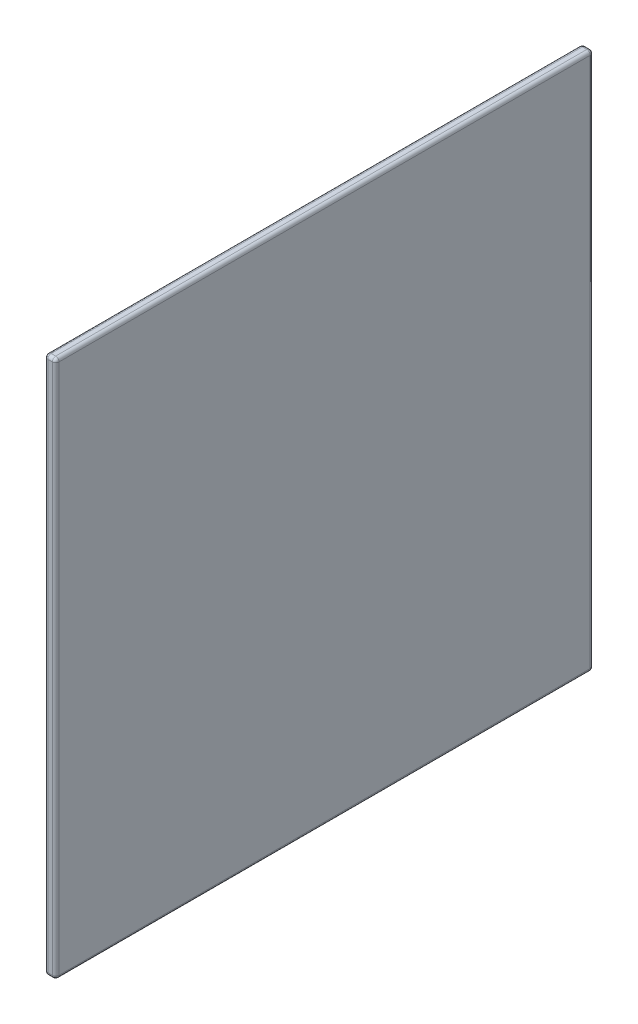
ISO-10303-21;
HEADER;
FILE_DESCRIPTION(('STEP AP214'),'2;1');
FILE_NAME('part.step','',(''),(''),'','','');
FILE_SCHEMA(('AUTOMOTIVE_DESIGN { 1 0 10303 214 1 1 1 1 }'));
ENDSEC;
DATA;
#1=APPLICATION_CONTEXT('core data for automotive mechanical design processes');
#2=APPLICATION_PROTOCOL_DEFINITION('international standard','automotive_design',2000,#1);
#3=PRODUCT_CONTEXT('',#1,'mechanical');
#4=PRODUCT('Part','Part','',(#3));
#5=PRODUCT_RELATED_PRODUCT_CATEGORY('part','',(#4));
#6=PRODUCT_DEFINITION_FORMATION('','',#4);
#7=PRODUCT_DEFINITION_CONTEXT('part definition',#1,'design');
#8=PRODUCT_DEFINITION('design','',#6,#7);
#9=PRODUCT_DEFINITION_SHAPE('','',#8);
#10=(LENGTH_UNIT() NAMED_UNIT(*) SI_UNIT(.MILLI.,.METRE.));
#11=(NAMED_UNIT(*) PLANE_ANGLE_UNIT() SI_UNIT($,.RADIAN.));
#12=(NAMED_UNIT(*) SI_UNIT($,.STERADIAN.) SOLID_ANGLE_UNIT());
#13=UNCERTAINTY_MEASURE_WITH_UNIT(LENGTH_MEASURE(1.E-05),#10,'distance_accuracy_value','');
#14=(GEOMETRIC_REPRESENTATION_CONTEXT(3) GLOBAL_UNCERTAINTY_ASSIGNED_CONTEXT((#13)) GLOBAL_UNIT_ASSIGNED_CONTEXT((#10,
#11,#12)) REPRESENTATION_CONTEXT('',''));
#15=CARTESIAN_POINT('',(0.,0.,0.));
#16=DIRECTION('',(0.,0.,1.));
#17=DIRECTION('',(1.,0.,0.));
#18=AXIS2_PLACEMENT_3D('',#15,#16,#17);
#19=CARTESIAN_POINT('',(8.45,23.7,23.7));
#20=DIRECTION('',(0.,-1.,0.));
#21=DIRECTION('',(1.,0.,0.));
#22=AXIS2_PLACEMENT_3D('',#19,#20,#21);
#23=SPHERICAL_SURFACE('',#22,0.3);
#24=CARTESIAN_POINT('',(8.45,23.7,23.7));
#25=DIRECTION('',(0.,0.,-1.));
#26=DIRECTION('',(1.,0.,0.));
#27=AXIS2_PLACEMENT_3D('',#24,#25,#26);
#28=CIRCLE('',#27,0.3);
#29=CARTESIAN_POINT('',(8.45,24.,23.7));
#30=VERTEX_POINT('',#29);
#31=CARTESIAN_POINT('',(8.75,23.7,23.7));
#32=VERTEX_POINT('',#31);
#33=EDGE_CURVE('E10',#30,#32,#28,.T.);
#34=ORIENTED_EDGE('',*,*,#33,.F.);
#35=CARTESIAN_POINT('',(8.45,23.7,23.7));
#36=DIRECTION('',(1.,0.,0.));
#37=DIRECTION('',(0.,0.,1.));
#38=AXIS2_PLACEMENT_3D('',#35,#36,#37);
#39=CIRCLE('',#38,0.3);
#40=CARTESIAN_POINT('',(8.45,23.7,24.));
#41=VERTEX_POINT('',#40);
#42=EDGE_CURVE('E297',#30,#41,#39,.T.);
#43=ORIENTED_EDGE('',*,*,#42,.T.);
#44=CARTESIAN_POINT('',(8.45,23.7,23.7));
#45=DIRECTION('',(0.,-1.,0.));
#46=DIRECTION('',(1.,0.,0.));
#47=AXIS2_PLACEMENT_3D('',#44,#45,#46);
#48=CIRCLE('',#47,0.3);
#49=EDGE_CURVE('E241',#32,#41,#48,.T.);
#50=ORIENTED_EDGE('',*,*,#49,.F.);
#51=EDGE_LOOP('',(#34,#43,#50));
#52=FACE_BOUND('',#51,.T.);
#53=ADVANCED_FACE('F16',(#52),#23,.T.);
#54=CARTESIAN_POINT('',(8.45,23.7,-23.7));
#55=DIRECTION('',(0.,0.,1.));
#56=DIRECTION('',(1.,0.,0.));
#57=AXIS2_PLACEMENT_3D('',#54,#55,#56);
#58=SPHERICAL_SURFACE('',#57,0.3);
#59=CARTESIAN_POINT('',(8.45,23.7,-23.7));
#60=DIRECTION('',(0.,-1.,0.));
#61=DIRECTION('',(1.,0.,0.));
#62=AXIS2_PLACEMENT_3D('',#59,#60,#61);
#63=CIRCLE('',#62,0.3);
#64=CARTESIAN_POINT('',(8.45,23.7,-24.));
#65=VERTEX_POINT('',#64);
#66=CARTESIAN_POINT('',(8.75,23.7,-23.7));
#67=VERTEX_POINT('',#66);
#68=EDGE_CURVE('E214',#65,#67,#63,.T.);
#69=ORIENTED_EDGE('',*,*,#68,.F.);
#70=CARTESIAN_POINT('',(8.45,23.7,-23.7));
#71=DIRECTION('',(1.,0.,0.));
#72=DIRECTION('',(0.,1.,0.));
#73=AXIS2_PLACEMENT_3D('',#70,#71,#72);
#74=CIRCLE('',#73,0.3);
#75=CARTESIAN_POINT('',(8.45,24.,-23.7));
#76=VERTEX_POINT('',#75);
#77=EDGE_CURVE('E230',#65,#76,#74,.T.);
#78=ORIENTED_EDGE('',*,*,#77,.T.);
#79=CARTESIAN_POINT('',(8.45,23.7,-23.7));
#80=DIRECTION('',(0.,0.,1.));
#81=DIRECTION('',(1.,0.,0.));
#82=AXIS2_PLACEMENT_3D('',#79,#80,#81);
#83=CIRCLE('',#82,0.3);
#84=EDGE_CURVE('E24',#67,#76,#83,.T.);
#85=ORIENTED_EDGE('',*,*,#84,.F.);
#86=EDGE_LOOP('',(#69,#78,#85));
#87=FACE_BOUND('',#86,.T.);
#88=ADVANCED_FACE('F310',(#87),#58,.T.);
#89=CARTESIAN_POINT('',(8.75,-24.,-24.));
#90=DIRECTION('',(1.,0.,0.));
#91=DIRECTION('',(0.,1.,0.));
#92=AXIS2_PLACEMENT_3D('',#89,#90,#91);
#93=PLANE('',#92);
#94=DIRECTION('',(0.,0.,1.));
#95=VECTOR('',#94,1.);
#96=CARTESIAN_POINT('',(8.75,-23.7,-24.));
#97=LINE('',#96,#95);
#98=CARTESIAN_POINT('',(8.75,-23.7,-23.7));
#99=VERTEX_POINT('',#98);
#100=CARTESIAN_POINT('',(8.75,-23.7,23.7));
#101=VERTEX_POINT('',#100);
#102=EDGE_CURVE('E227',#99,#101,#97,.T.);
#103=ORIENTED_EDGE('',*,*,#102,.F.);
#104=DIRECTION('',(0.,1.,0.));
#105=VECTOR('',#104,1.);
#106=CARTESIAN_POINT('',(8.75,-24.,-23.7));
#107=LINE('',#106,#105);
#108=EDGE_CURVE('E218',#99,#67,#107,.T.);
#109=ORIENTED_EDGE('',*,*,#108,.T.);
#110=DIRECTION('',(0.,0.,1.));
#111=VECTOR('',#110,1.);
#112=CARTESIAN_POINT('',(8.75,23.7,-24.));
#113=LINE('',#112,#111);
#114=EDGE_CURVE('E223',#67,#32,#113,.T.);
#115=ORIENTED_EDGE('',*,*,#114,.T.);
#116=DIRECTION('',(0.,1.,0.));
#117=VECTOR('',#116,1.);
#118=CARTESIAN_POINT('',(8.75,-24.,23.7));
#119=LINE('',#118,#117);
#120=EDGE_CURVE('E244',#101,#32,#119,.T.);
#121=ORIENTED_EDGE('',*,*,#120,.F.);
#122=EDGE_LOOP('',(#103,#109,#115,#121));
#123=FACE_BOUND('',#122,.T.);
#124=ADVANCED_FACE('F381',(#123),#93,.T.);
#125=CARTESIAN_POINT('',(8.45,-23.7,23.7));
#126=DIRECTION('',(0.,0.,-1.));
#127=DIRECTION('',(1.,0.,0.));
#128=AXIS2_PLACEMENT_3D('',#125,#126,#127);
#129=SPHERICAL_SURFACE('',#128,0.3);
#130=CARTESIAN_POINT('',(8.45,-23.7,23.7));
#131=DIRECTION('',(0.,1.,0.));
#132=DIRECTION('',(1.,0.,0.));
#133=AXIS2_PLACEMENT_3D('',#130,#131,#132);
#134=CIRCLE('',#133,0.3);
#135=CARTESIAN_POINT('',(8.45,-23.7,24.));
#136=VERTEX_POINT('',#135);
#137=EDGE_CURVE('E226',#136,#101,#134,.T.);
#138=ORIENTED_EDGE('',*,*,#137,.F.);
#139=CARTESIAN_POINT('',(8.45,-23.7,23.7));
#140=DIRECTION('',(1.,0.,0.));
#141=DIRECTION('',(0.,-1.,0.));
#142=AXIS2_PLACEMENT_3D('',#139,#140,#141);
#143=CIRCLE('',#142,0.3);
#144=CARTESIAN_POINT('',(8.45,-24.,23.7));
#145=VERTEX_POINT('',#144);
#146=EDGE_CURVE('E140',#136,#145,#143,.T.);
#147=ORIENTED_EDGE('',*,*,#146,.T.);
#148=CARTESIAN_POINT('',(8.45,-23.7,23.7));
#149=DIRECTION('',(0.,0.,-1.));
#150=DIRECTION('',(1.,0.,0.));
#151=AXIS2_PLACEMENT_3D('',#148,#149,#150);
#152=CIRCLE('',#151,0.3);
#153=EDGE_CURVE('E284',#101,#145,#152,.T.);
#154=ORIENTED_EDGE('',*,*,#153,.F.);
#155=EDGE_LOOP('',(#138,#147,#154));
#156=FACE_BOUND('',#155,.T.);
#157=ADVANCED_FACE('F376',(#156),#129,.T.);
#158=CARTESIAN_POINT('',(8.45,-23.7,-23.7));
#159=DIRECTION('',(0.,0.,1.));
#160=DIRECTION('',(1.,0.,0.));
#161=AXIS2_PLACEMENT_3D('',#158,#159,#160);
#162=SPHERICAL_SURFACE('',#161,0.3);
#163=CARTESIAN_POINT('',(8.45,-23.7,-23.7));
#164=DIRECTION('',(0.,0.,-1.));
#165=DIRECTION('',(1.,0.,0.));
#166=AXIS2_PLACEMENT_3D('',#163,#164,#165);
#167=CIRCLE('',#166,0.3);
#168=CARTESIAN_POINT('',(8.45,-24.,-23.7));
#169=VERTEX_POINT('',#168);
#170=EDGE_CURVE('E231',#99,#169,#167,.T.);
#171=ORIENTED_EDGE('',*,*,#170,.T.);
#172=CARTESIAN_POINT('',(8.45,-23.7,-23.7));
#173=DIRECTION('',(-1.,0.,0.));
#174=DIRECTION('',(0.,-1.,0.));
#175=AXIS2_PLACEMENT_3D('',#172,#173,#174);
#176=CIRCLE('',#175,0.3);
#177=CARTESIAN_POINT('',(8.45,-23.7,-24.));
#178=VERTEX_POINT('',#177);
#179=EDGE_CURVE('E275',#178,#169,#176,.T.);
#180=ORIENTED_EDGE('',*,*,#179,.F.);
#181=CARTESIAN_POINT('',(8.45,-23.7,-23.7));
#182=DIRECTION('',(0.,-1.,0.));
#183=DIRECTION('',(1.,0.,0.));
#184=AXIS2_PLACEMENT_3D('',#181,#182,#183);
#185=CIRCLE('',#184,0.3);
#186=EDGE_CURVE('E219',#178,#99,#185,.T.);
#187=ORIENTED_EDGE('',*,*,#186,.T.);
#188=EDGE_LOOP('',(#171,#180,#187));
#189=FACE_BOUND('',#188,.T.);
#190=ADVANCED_FACE('F396',(#189),#162,.T.);
#191=CARTESIAN_POINT('',(8.45,23.7,-24.));
#192=DIRECTION('',(0.,0.,1.));
#193=DIRECTION('',(1.,0.,0.));
#194=AXIS2_PLACEMENT_3D('',#191,#192,#193);
#195=CYLINDRICAL_SURFACE('',#194,0.3);
#196=ORIENTED_EDGE('',*,*,#114,.F.);
#197=ORIENTED_EDGE('',*,*,#84,.T.);
#198=DIRECTION('',(0.,0.,1.));
#199=VECTOR('',#198,1.);
#200=CARTESIAN_POINT('',(8.45,24.,-24.));
#201=LINE('',#200,#199);
#202=EDGE_CURVE('E271',#76,#30,#201,.T.);
#203=ORIENTED_EDGE('',*,*,#202,.T.);
#204=ORIENTED_EDGE('',*,*,#33,.T.);
#205=EDGE_LOOP('',(#196,#197,#203,#204));
#206=FACE_BOUND('',#205,.T.);
#207=ADVANCED_FACE('F307',(#206),#195,.T.);
#208=CARTESIAN_POINT('',(8.45,-24.,23.7));
#209=DIRECTION('',(0.,1.,0.));
#210=DIRECTION('',(1.,0.,0.));
#211=AXIS2_PLACEMENT_3D('',#208,#209,#210);
#212=CYLINDRICAL_SURFACE('',#211,0.3);
#213=ORIENTED_EDGE('',*,*,#120,.T.);
#214=ORIENTED_EDGE('',*,*,#49,.T.);
#215=DIRECTION('',(0.,1.,0.));
#216=VECTOR('',#215,1.);
#217=CARTESIAN_POINT('',(8.45,-24.,24.));
#218=LINE('',#217,#216);
#219=EDGE_CURVE('E146',#136,#41,#218,.T.);
#220=ORIENTED_EDGE('',*,*,#219,.F.);
#221=ORIENTED_EDGE('',*,*,#137,.T.);
#222=EDGE_LOOP('',(#213,#214,#220,#221));
#223=FACE_BOUND('',#222,.T.);
#224=ADVANCED_FACE('F379',(#223),#212,.T.);
#225=CARTESIAN_POINT('',(7.75,23.7,23.7));
#226=DIRECTION('',(1.,0.,0.));
#227=DIRECTION('',(0.,1.,0.));
#228=AXIS2_PLACEMENT_3D('',#225,#226,#227);
#229=CYLINDRICAL_SURFACE('',#228,0.3);
#230=CARTESIAN_POINT('',(8.05,23.7,23.7));
#231=DIRECTION('',(1.,0.,0.));
#232=DIRECTION('',(0.,0.,1.));
#233=AXIS2_PLACEMENT_3D('',#230,#231,#232);
#234=CIRCLE('',#233,0.3);
#235=CARTESIAN_POINT('',(8.05,24.,23.7));
#236=VERTEX_POINT('',#235);
#237=CARTESIAN_POINT('',(8.05,23.7,24.));
#238=VERTEX_POINT('',#237);
#239=EDGE_CURVE('E266',#236,#238,#234,.T.);
#240=ORIENTED_EDGE('',*,*,#239,.T.);
#241=DIRECTION('',(1.,0.,0.));
#242=VECTOR('',#241,1.);
#243=CARTESIAN_POINT('',(7.75,23.7,24.));
#244=LINE('',#243,#242);
#245=EDGE_CURVE('E165',#238,#41,#244,.T.);
#246=ORIENTED_EDGE('',*,*,#245,.T.);
#247=ORIENTED_EDGE('',*,*,#42,.F.);
#248=DIRECTION('',(1.,0.,0.));
#249=VECTOR('',#248,1.);
#250=CARTESIAN_POINT('',(7.75,24.,23.7));
#251=LINE('',#250,#249);
#252=EDGE_CURVE('E267',#236,#30,#251,.T.);
#253=ORIENTED_EDGE('',*,*,#252,.F.);
#254=EDGE_LOOP('',(#240,#246,#247,#253));
#255=FACE_BOUND('',#254,.T.);
#256=ADVANCED_FACE('F322',(#255),#229,.T.);
#257=CARTESIAN_POINT('',(8.45,-24.,-23.7));
#258=DIRECTION('',(0.,1.,0.));
#259=DIRECTION('',(1.,0.,0.));
#260=AXIS2_PLACEMENT_3D('',#257,#258,#259);
#261=CYLINDRICAL_SURFACE('',#260,0.3);
#262=ORIENTED_EDGE('',*,*,#186,.F.);
#263=DIRECTION('',(0.,1.,0.));
#264=VECTOR('',#263,1.);
#265=CARTESIAN_POINT('',(8.45,-24.,-24.));
#266=LINE('',#265,#264);
#267=EDGE_CURVE('E251',#178,#65,#266,.T.);
#268=ORIENTED_EDGE('',*,*,#267,.T.);
#269=ORIENTED_EDGE('',*,*,#68,.T.);
#270=ORIENTED_EDGE('',*,*,#108,.F.);
#271=EDGE_LOOP('',(#262,#268,#269,#270));
#272=FACE_BOUND('',#271,.T.);
#273=ADVANCED_FACE('F406',(#272),#261,.T.);
#274=CARTESIAN_POINT('',(7.75,23.7,-23.7));
#275=DIRECTION('',(1.,0.,0.));
#276=DIRECTION('',(0.,1.,0.));
#277=AXIS2_PLACEMENT_3D('',#274,#275,#276);
#278=CYLINDRICAL_SURFACE('',#277,0.3);
#279=DIRECTION('',(1.,0.,0.));
#280=VECTOR('',#279,1.);
#281=CARTESIAN_POINT('',(7.75,24.,-23.7));
#282=LINE('',#281,#280);
#283=CARTESIAN_POINT('',(8.05,24.,-23.7));
#284=VERTEX_POINT('',#283);
#285=EDGE_CURVE('E274',#284,#76,#282,.T.);
#286=ORIENTED_EDGE('',*,*,#285,.T.);
#287=ORIENTED_EDGE('',*,*,#77,.F.);
#288=DIRECTION('',(1.,0.,0.));
#289=VECTOR('',#288,1.);
#290=CARTESIAN_POINT('',(7.75,23.7,-24.));
#291=LINE('',#290,#289);
#292=CARTESIAN_POINT('',(8.05,23.7,-24.));
#293=VERTEX_POINT('',#292);
#294=EDGE_CURVE('E247',#293,#65,#291,.T.);
#295=ORIENTED_EDGE('',*,*,#294,.F.);
#296=CARTESIAN_POINT('',(8.05,23.7,-23.7));
#297=DIRECTION('',(1.,0.,0.));
#298=DIRECTION('',(0.,1.,0.));
#299=AXIS2_PLACEMENT_3D('',#296,#297,#298);
#300=CIRCLE('',#299,0.3);
#301=EDGE_CURVE('E147',#293,#284,#300,.T.);
#302=ORIENTED_EDGE('',*,*,#301,.T.);
#303=EDGE_LOOP('',(#286,#287,#295,#302));
#304=FACE_BOUND('',#303,.T.);
#305=ADVANCED_FACE('F313',(#304),#278,.T.);
#306=CARTESIAN_POINT('',(8.45,-23.7,-24.));
#307=DIRECTION('',(0.,0.,1.));
#308=DIRECTION('',(1.,0.,0.));
#309=AXIS2_PLACEMENT_3D('',#306,#307,#308);
#310=CYLINDRICAL_SURFACE('',#309,0.3);
#311=ORIENTED_EDGE('',*,*,#153,.T.);
#312=DIRECTION('',(0.,0.,1.));
#313=VECTOR('',#312,1.);
#314=CARTESIAN_POINT('',(8.45,-24.,-24.));
#315=LINE('',#314,#313);
#316=EDGE_CURVE('E236',#169,#145,#315,.T.);
#317=ORIENTED_EDGE('',*,*,#316,.F.);
#318=ORIENTED_EDGE('',*,*,#170,.F.);
#319=ORIENTED_EDGE('',*,*,#102,.T.);
#320=EDGE_LOOP('',(#311,#317,#318,#319));
#321=FACE_BOUND('',#320,.T.);
#322=ADVANCED_FACE('F372',(#321),#310,.T.);
#323=CARTESIAN_POINT('',(7.75,-23.7,23.7));
#324=DIRECTION('',(1.,0.,0.));
#325=DIRECTION('',(0.,-1.,0.));
#326=AXIS2_PLACEMENT_3D('',#323,#324,#325);
#327=CYLINDRICAL_SURFACE('',#326,0.3);
#328=DIRECTION('',(1.,0.,0.));
#329=VECTOR('',#328,1.);
#330=CARTESIAN_POINT('',(7.75,-24.,23.7));
#331=LINE('',#330,#329);
#332=CARTESIAN_POINT('',(8.05,-24.,23.7));
#333=VERTEX_POINT('',#332);
#334=EDGE_CURVE('E240',#333,#145,#331,.T.);
#335=ORIENTED_EDGE('',*,*,#334,.T.);
#336=ORIENTED_EDGE('',*,*,#146,.F.);
#337=DIRECTION('',(1.,0.,0.));
#338=VECTOR('',#337,1.);
#339=CARTESIAN_POINT('',(7.75,-23.7,24.));
#340=LINE('',#339,#338);
#341=CARTESIAN_POINT('',(8.05,-23.7,24.));
#342=VERTEX_POINT('',#341);
#343=EDGE_CURVE('E133',#342,#136,#340,.T.);
#344=ORIENTED_EDGE('',*,*,#343,.F.);
#345=CARTESIAN_POINT('',(8.05,-23.7,23.7));
#346=DIRECTION('',(1.,0.,0.));
#347=DIRECTION('',(0.,-1.,0.));
#348=AXIS2_PLACEMENT_3D('',#345,#346,#347);
#349=CIRCLE('',#348,0.3);
#350=EDGE_CURVE('E137',#342,#333,#349,.T.);
#351=ORIENTED_EDGE('',*,*,#350,.T.);
#352=EDGE_LOOP('',(#335,#336,#344,#351));
#353=FACE_BOUND('',#352,.T.);
#354=ADVANCED_FACE('F136',(#353),#327,.T.);
#355=CARTESIAN_POINT('',(7.75,-23.7,-23.7));
#356=DIRECTION('',(1.,0.,0.));
#357=DIRECTION('',(0.,-1.,0.));
#358=AXIS2_PLACEMENT_3D('',#355,#356,#357);
#359=CYLINDRICAL_SURFACE('',#358,0.3);
#360=CARTESIAN_POINT('',(8.05,-23.7,-23.7));
#361=DIRECTION('',(-1.,0.,0.));
#362=DIRECTION('',(0.,-1.,0.));
#363=AXIS2_PLACEMENT_3D('',#360,#361,#362);
#364=CIRCLE('',#363,0.3);
#365=CARTESIAN_POINT('',(8.05,-23.7,-24.));
#366=VERTEX_POINT('',#365);
#367=CARTESIAN_POINT('',(8.05,-24.,-23.7));
#368=VERTEX_POINT('',#367);
#369=EDGE_CURVE('E158',#366,#368,#364,.T.);
#370=ORIENTED_EDGE('',*,*,#369,.F.);
#371=DIRECTION('',(1.,0.,0.));
#372=VECTOR('',#371,1.);
#373=CARTESIAN_POINT('',(7.75,-23.7,-24.));
#374=LINE('',#373,#372);
#375=EDGE_CURVE('E255',#366,#178,#374,.T.);
#376=ORIENTED_EDGE('',*,*,#375,.T.);
#377=ORIENTED_EDGE('',*,*,#179,.T.);
#378=DIRECTION('',(1.,0.,0.));
#379=VECTOR('',#378,1.);
#380=CARTESIAN_POINT('',(7.75,-24.,-23.7));
#381=LINE('',#380,#379);
#382=EDGE_CURVE('E157',#368,#169,#381,.T.);
#383=ORIENTED_EDGE('',*,*,#382,.F.);
#384=EDGE_LOOP('',(#370,#376,#377,#383));
#385=FACE_BOUND('',#384,.T.);
#386=ADVANCED_FACE('F360',(#385),#359,.T.);
#387=CARTESIAN_POINT('',(7.75,24.,-24.));
#388=DIRECTION('',(0.,1.,0.));
#389=DIRECTION('',(1.,0.,0.));
#390=AXIS2_PLACEMENT_3D('',#387,#388,#389);
#391=PLANE('',#390);
#392=DIRECTION('',(0.,0.,1.));
#393=VECTOR('',#392,1.);
#394=CARTESIAN_POINT('',(8.05,24.,-24.));
#395=LINE('',#394,#393);
#396=EDGE_CURVE('E210',#284,#236,#395,.T.);
#397=ORIENTED_EDGE('',*,*,#396,.T.);
#398=ORIENTED_EDGE('',*,*,#252,.T.);
#399=ORIENTED_EDGE('',*,*,#202,.F.);
#400=ORIENTED_EDGE('',*,*,#285,.F.);
#401=EDGE_LOOP('',(#397,#398,#399,#400));
#402=FACE_BOUND('',#401,.T.);
#403=ADVANCED_FACE('F316',(#402),#391,.T.);
#404=CARTESIAN_POINT('',(8.05,23.7,23.7));
#405=DIRECTION('',(0.,-1.,0.));
#406=DIRECTION('',(-1.,0.,0.));
#407=AXIS2_PLACEMENT_3D('',#404,#405,#406);
#408=SPHERICAL_SURFACE('',#407,0.3);
#409=CARTESIAN_POINT('',(8.05,23.7,23.7));
#410=DIRECTION('',(0.,1.,0.));
#411=DIRECTION('',(-1.,0.,0.));
#412=AXIS2_PLACEMENT_3D('',#409,#410,#411);
#413=CIRCLE('',#412,0.3);
#414=CARTESIAN_POINT('',(7.75,23.7,23.7));
#415=VERTEX_POINT('',#414);
#416=EDGE_CURVE('E170',#415,#238,#413,.T.);
#417=ORIENTED_EDGE('',*,*,#416,.T.);
#418=ORIENTED_EDGE('',*,*,#239,.F.);
#419=CARTESIAN_POINT('',(8.05,23.7,23.7));
#420=DIRECTION('',(0.,0.,1.));
#421=DIRECTION('',(-1.,0.,0.));
#422=AXIS2_PLACEMENT_3D('',#419,#420,#421);
#423=CIRCLE('',#422,0.3);
#424=EDGE_CURVE('E198',#236,#415,#423,.T.);
#425=ORIENTED_EDGE('',*,*,#424,.T.);
#426=EDGE_LOOP('',(#417,#418,#425));
#427=FACE_BOUND('',#426,.T.);
#428=ADVANCED_FACE('F324',(#427),#408,.T.);
#429=CARTESIAN_POINT('',(7.75,-24.,24.));
#430=DIRECTION('',(0.,0.,1.));
#431=DIRECTION('',(1.,0.,0.));
#432=AXIS2_PLACEMENT_3D('',#429,#430,#431);
#433=PLANE('',#432);
#434=DIRECTION('',(0.,1.,0.));
#435=VECTOR('',#434,1.);
#436=CARTESIAN_POINT('',(8.05,-24.,24.));
#437=LINE('',#436,#435);
#438=EDGE_CURVE('E162',#342,#238,#437,.T.);
#439=ORIENTED_EDGE('',*,*,#438,.F.);
#440=ORIENTED_EDGE('',*,*,#343,.T.);
#441=ORIENTED_EDGE('',*,*,#219,.T.);
#442=ORIENTED_EDGE('',*,*,#245,.F.);
#443=EDGE_LOOP('',(#439,#440,#441,#442));
#444=FACE_BOUND('',#443,.T.);
#445=ADVANCED_FACE('F163',(#444),#433,.T.);
#446=CARTESIAN_POINT('',(8.05,23.7,-23.7));
#447=DIRECTION('',(0.,0.,1.));
#448=DIRECTION('',(-1.,0.,0.));
#449=AXIS2_PLACEMENT_3D('',#446,#447,#448);
#450=SPHERICAL_SURFACE('',#449,0.3);
#451=CARTESIAN_POINT('',(8.05,23.7,-23.7));
#452=DIRECTION('',(0.,0.,-1.));
#453=DIRECTION('',(-1.,0.,0.));
#454=AXIS2_PLACEMENT_3D('',#451,#452,#453);
#455=CIRCLE('',#454,0.3);
#456=CARTESIAN_POINT('',(7.75,23.7,-23.7));
#457=VERTEX_POINT('',#456);
#458=EDGE_CURVE('E187',#457,#284,#455,.T.);
#459=ORIENTED_EDGE('',*,*,#458,.T.);
#460=ORIENTED_EDGE('',*,*,#301,.F.);
#461=CARTESIAN_POINT('',(8.05,23.7,-23.7));
#462=DIRECTION('',(0.,1.,0.));
#463=DIRECTION('',(-1.,0.,0.));
#464=AXIS2_PLACEMENT_3D('',#461,#462,#463);
#465=CIRCLE('',#464,0.3);
#466=EDGE_CURVE('E202',#293,#457,#465,.T.);
#467=ORIENTED_EDGE('',*,*,#466,.T.);
#468=EDGE_LOOP('',(#459,#460,#467));
#469=FACE_BOUND('',#468,.T.);
#470=ADVANCED_FACE('F354',(#469),#450,.T.);
#471=CARTESIAN_POINT('',(7.75,-24.,-24.));
#472=DIRECTION('',(0.,0.,1.));
#473=DIRECTION('',(1.,0.,0.));
#474=AXIS2_PLACEMENT_3D('',#471,#472,#473);
#475=PLANE('',#474);
#476=ORIENTED_EDGE('',*,*,#294,.T.);
#477=ORIENTED_EDGE('',*,*,#267,.F.);
#478=ORIENTED_EDGE('',*,*,#375,.F.);
#479=DIRECTION('',(0.,1.,0.));
#480=VECTOR('',#479,1.);
#481=CARTESIAN_POINT('',(8.05,-24.,-24.));
#482=LINE('',#481,#480);
#483=EDGE_CURVE('E183',#366,#293,#482,.T.);
#484=ORIENTED_EDGE('',*,*,#483,.T.);
#485=EDGE_LOOP('',(#476,#477,#478,#484));
#486=FACE_BOUND('',#485,.T.);
#487=ADVANCED_FACE('F357',(#486),#475,.F.);
#488=CARTESIAN_POINT('',(7.75,-24.,-24.));
#489=DIRECTION('',(0.,1.,0.));
#490=DIRECTION('',(1.,0.,0.));
#491=AXIS2_PLACEMENT_3D('',#488,#489,#490);
#492=PLANE('',#491);
#493=ORIENTED_EDGE('',*,*,#382,.T.);
#494=ORIENTED_EDGE('',*,*,#316,.T.);
#495=ORIENTED_EDGE('',*,*,#334,.F.);
#496=DIRECTION('',(0.,0.,1.));
#497=VECTOR('',#496,1.);
#498=CARTESIAN_POINT('',(8.05,-24.,-24.));
#499=LINE('',#498,#497);
#500=EDGE_CURVE('E192',#368,#333,#499,.T.);
#501=ORIENTED_EDGE('',*,*,#500,.F.);
#502=EDGE_LOOP('',(#493,#494,#495,#501));
#503=FACE_BOUND('',#502,.T.);
#504=ADVANCED_FACE('F368',(#503),#492,.F.);
#505=CARTESIAN_POINT('',(8.05,-23.7,23.7));
#506=DIRECTION('',(0.,0.,-1.));
#507=DIRECTION('',(-1.,0.,0.));
#508=AXIS2_PLACEMENT_3D('',#505,#506,#507);
#509=SPHERICAL_SURFACE('',#508,0.3);
#510=CARTESIAN_POINT('',(8.05,-23.7,23.7));
#511=DIRECTION('',(0.,0.,1.));
#512=DIRECTION('',(-1.,0.,0.));
#513=AXIS2_PLACEMENT_3D('',#510,#511,#512);
#514=CIRCLE('',#513,0.3);
#515=CARTESIAN_POINT('',(7.75,-23.7,23.7));
#516=VERTEX_POINT('',#515);
#517=EDGE_CURVE('E154',#516,#333,#514,.T.);
#518=ORIENTED_EDGE('',*,*,#517,.T.);
#519=ORIENTED_EDGE('',*,*,#350,.F.);
#520=CARTESIAN_POINT('',(8.05,-23.7,23.7));
#521=DIRECTION('',(0.,-1.,0.));
#522=DIRECTION('',(-1.,0.,0.));
#523=AXIS2_PLACEMENT_3D('',#520,#521,#522);
#524=CIRCLE('',#523,0.3);
#525=EDGE_CURVE('E152',#342,#516,#524,.T.);
#526=ORIENTED_EDGE('',*,*,#525,.T.);
#527=EDGE_LOOP('',(#518,#519,#526));
#528=FACE_BOUND('',#527,.T.);
#529=ADVANCED_FACE('F150',(#528),#509,.T.);
#530=CARTESIAN_POINT('',(8.05,-23.7,-23.7));
#531=DIRECTION('',(0.,0.,1.));
#532=DIRECTION('',(-1.,0.,0.));
#533=AXIS2_PLACEMENT_3D('',#530,#531,#532);
#534=SPHERICAL_SURFACE('',#533,0.3);
#535=CARTESIAN_POINT('',(8.05,-23.7,-23.7));
#536=DIRECTION('',(0.,1.,0.));
#537=DIRECTION('',(-1.,0.,0.));
#538=AXIS2_PLACEMENT_3D('',#535,#536,#537);
#539=CIRCLE('',#538,0.3);
#540=CARTESIAN_POINT('',(7.75,-23.7,-23.7));
#541=VERTEX_POINT('',#540);
#542=EDGE_CURVE('E177',#366,#541,#539,.T.);
#543=ORIENTED_EDGE('',*,*,#542,.F.);
#544=ORIENTED_EDGE('',*,*,#369,.T.);
#545=CARTESIAN_POINT('',(8.05,-23.7,-23.7));
#546=DIRECTION('',(0.,0.,1.));
#547=DIRECTION('',(-1.,0.,0.));
#548=AXIS2_PLACEMENT_3D('',#545,#546,#547);
#549=CIRCLE('',#548,0.3);
#550=EDGE_CURVE('E189',#541,#368,#549,.T.);
#551=ORIENTED_EDGE('',*,*,#550,.F.);
#552=EDGE_LOOP('',(#543,#544,#551));
#553=FACE_BOUND('',#552,.T.);
#554=ADVANCED_FACE('F363',(#553),#534,.T.);
#555=CARTESIAN_POINT('',(8.05,23.7,-24.));
#556=DIRECTION('',(0.,0.,1.));
#557=DIRECTION('',(-1.,0.,0.));
#558=AXIS2_PLACEMENT_3D('',#555,#556,#557);
#559=CYLINDRICAL_SURFACE('',#558,0.3);
#560=ORIENTED_EDGE('',*,*,#424,.F.);
#561=ORIENTED_EDGE('',*,*,#396,.F.);
#562=ORIENTED_EDGE('',*,*,#458,.F.);
#563=DIRECTION('',(0.,0.,1.));
#564=VECTOR('',#563,1.);
#565=CARTESIAN_POINT('',(7.75,23.7,-24.));
#566=LINE('',#565,#564);
#567=EDGE_CURVE('E335',#457,#415,#566,.T.);
#568=ORIENTED_EDGE('',*,*,#567,.T.);
#569=EDGE_LOOP('',(#560,#561,#562,#568));
#570=FACE_BOUND('',#569,.T.);
#571=ADVANCED_FACE('F352',(#570),#559,.T.);
#572=CARTESIAN_POINT('',(8.05,-24.,23.7));
#573=DIRECTION('',(0.,1.,0.));
#574=DIRECTION('',(-1.,0.,0.));
#575=AXIS2_PLACEMENT_3D('',#572,#573,#574);
#576=CYLINDRICAL_SURFACE('',#575,0.3);
#577=ORIENTED_EDGE('',*,*,#525,.F.);
#578=ORIENTED_EDGE('',*,*,#438,.T.);
#579=ORIENTED_EDGE('',*,*,#416,.F.);
#580=DIRECTION('',(0.,1.,0.));
#581=VECTOR('',#580,1.);
#582=CARTESIAN_POINT('',(7.75,-24.,23.7));
#583=LINE('',#582,#581);
#584=EDGE_CURVE('E175',#516,#415,#583,.T.);
#585=ORIENTED_EDGE('',*,*,#584,.F.);
#586=EDGE_LOOP('',(#577,#578,#579,#585));
#587=FACE_BOUND('',#586,.T.);
#588=ADVANCED_FACE('F173',(#587),#576,.T.);
#589=CARTESIAN_POINT('',(8.05,-24.,-23.7));
#590=DIRECTION('',(0.,1.,0.));
#591=DIRECTION('',(-1.,0.,0.));
#592=AXIS2_PLACEMENT_3D('',#589,#590,#591);
#593=CYLINDRICAL_SURFACE('',#592,0.3);
#594=DIRECTION('',(0.,1.,0.));
#595=VECTOR('',#594,1.);
#596=CARTESIAN_POINT('',(7.75,-24.,-23.7));
#597=LINE('',#596,#595);
#598=EDGE_CURVE('E332',#541,#457,#597,.T.);
#599=ORIENTED_EDGE('',*,*,#598,.T.);
#600=ORIENTED_EDGE('',*,*,#466,.F.);
#601=ORIENTED_EDGE('',*,*,#483,.F.);
#602=ORIENTED_EDGE('',*,*,#542,.T.);
#603=EDGE_LOOP('',(#599,#600,#601,#602));
#604=FACE_BOUND('',#603,.T.);
#605=ADVANCED_FACE('F345',(#604),#593,.T.);
#606=CARTESIAN_POINT('',(8.05,-23.7,-24.));
#607=DIRECTION('',(0.,0.,1.));
#608=DIRECTION('',(-1.,0.,0.));
#609=AXIS2_PLACEMENT_3D('',#606,#607,#608);
#610=CYLINDRICAL_SURFACE('',#609,0.3);
#611=DIRECTION('',(0.,0.,1.));
#612=VECTOR('',#611,1.);
#613=CARTESIAN_POINT('',(7.75,-23.7,-24.));
#614=LINE('',#613,#612);
#615=EDGE_CURVE('E193',#541,#516,#614,.T.);
#616=ORIENTED_EDGE('',*,*,#615,.F.);
#617=ORIENTED_EDGE('',*,*,#550,.T.);
#618=ORIENTED_EDGE('',*,*,#500,.T.);
#619=ORIENTED_EDGE('',*,*,#517,.F.);
#620=EDGE_LOOP('',(#616,#617,#618,#619));
#621=FACE_BOUND('',#620,.T.);
#622=ADVANCED_FACE('F366',(#621),#610,.T.);
#623=CARTESIAN_POINT('',(7.75,-24.,-24.));
#624=DIRECTION('',(1.,0.,0.));
#625=DIRECTION('',(0.,1.,0.));
#626=AXIS2_PLACEMENT_3D('',#623,#624,#625);
#627=PLANE('',#626);
#628=ORIENTED_EDGE('',*,*,#584,.T.);
#629=ORIENTED_EDGE('',*,*,#567,.F.);
#630=ORIENTED_EDGE('',*,*,#598,.F.);
#631=ORIENTED_EDGE('',*,*,#615,.T.);
#632=EDGE_LOOP('',(#628,#629,#630,#631));
#633=FACE_BOUND('',#632,.T.);
#634=ADVANCED_FACE('F350',(#633),#627,.F.);
#635=CLOSED_SHELL('',(#53,#88,#124,#157,#190,#207,#224,#256,#273,#305,#322,#354,#386,#403,#428,
#445,#470,#487,#504,#529,#554,#571,#588,#605,#622,#634));
#636=MANIFOLD_SOLID_BREP('B1',#635);
#637=ADVANCED_BREP_SHAPE_REPRESENTATION('',(#18,#636),#14);
#638=SHAPE_DEFINITION_REPRESENTATION(#9,#637);
ENDSEC;
END-ISO-10303-21;
